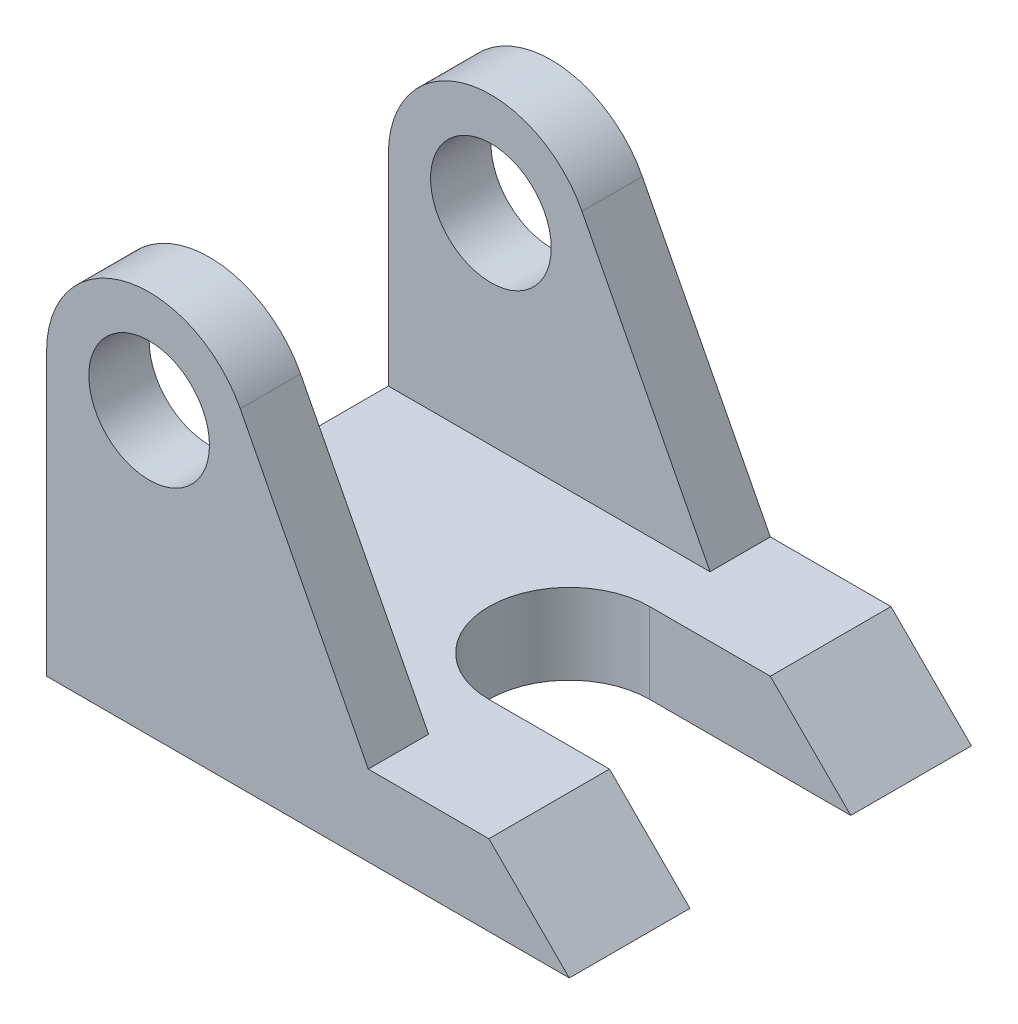
ISO-10303-21;
HEADER;
FILE_DESCRIPTION(('STEP AP214'),'2;1');
FILE_NAME('part.step','',(''),(''),'','','');
FILE_SCHEMA(('AUTOMOTIVE_DESIGN { 1 0 10303 214 1 1 1 1 }'));
ENDSEC;
DATA;
#1=APPLICATION_CONTEXT('core data for automotive mechanical design processes');
#2=APPLICATION_PROTOCOL_DEFINITION('international standard','automotive_design',2000,#1);
#3=PRODUCT_CONTEXT('',#1,'mechanical');
#4=PRODUCT('Part','Part','',(#3));
#5=PRODUCT_RELATED_PRODUCT_CATEGORY('part','',(#4));
#6=PRODUCT_DEFINITION_FORMATION('','',#4);
#7=PRODUCT_DEFINITION_CONTEXT('part definition',#1,'design');
#8=PRODUCT_DEFINITION('design','',#6,#7);
#9=PRODUCT_DEFINITION_SHAPE('','',#8);
#10=(LENGTH_UNIT() NAMED_UNIT(*) SI_UNIT(.MILLI.,.METRE.));
#11=(NAMED_UNIT(*) PLANE_ANGLE_UNIT() SI_UNIT($,.RADIAN.));
#12=(NAMED_UNIT(*) SI_UNIT($,.STERADIAN.) SOLID_ANGLE_UNIT());
#13=UNCERTAINTY_MEASURE_WITH_UNIT(LENGTH_MEASURE(1.E-05),#10,'distance_accuracy_value','');
#14=(GEOMETRIC_REPRESENTATION_CONTEXT(3) GLOBAL_UNCERTAINTY_ASSIGNED_CONTEXT((#13)) GLOBAL_UNIT_ASSIGNED_CONTEXT((#10,
#11,#12)) REPRESENTATION_CONTEXT('',''));
#15=CARTESIAN_POINT('',(0.,0.,0.));
#16=DIRECTION('',(0.,0.,1.));
#17=DIRECTION('',(1.,0.,0.));
#18=AXIS2_PLACEMENT_3D('',#15,#16,#17);
#19=CARTESIAN_POINT('',(25.5,70.,-50.));
#20=DIRECTION('',(0.,0.,-1.));
#21=DIRECTION('',(-1.,0.,0.));
#22=AXIS2_PLACEMENT_3D('',#19,#20,#21);
#23=PLANE('',#22);
#24=DIRECTION('',(0.,-1.,0.));
#25=VECTOR('',#24,1.);
#26=CARTESIAN_POINT('',(0.,0.,-50.));
#27=LINE('',#26,#25);
#28=CARTESIAN_POINT('',(0.,70.,-50.));
#29=VERTEX_POINT('',#28);
#30=CARTESIAN_POINT('',(0.,0.,-50.));
#31=VERTEX_POINT('',#30);
#32=EDGE_CURVE('E214',#29,#31,#27,.T.);
#33=ORIENTED_EDGE('',*,*,#32,.F.);
#34=CARTESIAN_POINT('',(25.5,70.,-50.));
#35=DIRECTION('',(0.,0.,1.));
#36=DIRECTION('',(-1.,0.,0.));
#37=AXIS2_PLACEMENT_3D('',#34,#35,#36);
#38=CIRCLE('',#37,25.5);
#39=CARTESIAN_POINT('',(48.1602175923075,81.6946371756151,-50.));
#40=VERTEX_POINT('',#39);
#41=EDGE_CURVE('E220',#40,#29,#38,.T.);
#42=ORIENTED_EDGE('',*,*,#41,.F.);
#43=DIRECTION('',(-0.458613222573142,0.888635984012057,0.));
#44=VECTOR('',#43,1.);
#45=CARTESIAN_POINT('',(80.,20.,-50.));
#46=LINE('',#45,#44);
#47=CARTESIAN_POINT('',(80.,20.,-50.));
#48=VERTEX_POINT('',#47);
#49=EDGE_CURVE('E251',#48,#40,#46,.T.);
#50=ORIENTED_EDGE('',*,*,#49,.F.);
#51=DIRECTION('',(-1.,0.,0.));
#52=VECTOR('',#51,1.);
#53=CARTESIAN_POINT('',(110.,20.,-50.));
#54=LINE('',#53,#52);
#55=CARTESIAN_POINT('',(110.,20.,-50.));
#56=VERTEX_POINT('',#55);
#57=EDGE_CURVE('E247',#56,#48,#54,.T.);
#58=ORIENTED_EDGE('',*,*,#57,.F.);
#59=DIRECTION('',(-0.707106781186548,0.707106781186547,0.));
#60=VECTOR('',#59,1.);
#61=CARTESIAN_POINT('',(130.,0.,-50.));
#62=LINE('',#61,#60);
#63=CARTESIAN_POINT('',(130.,0.,-50.));
#64=VERTEX_POINT('',#63);
#65=EDGE_CURVE('E243',#64,#56,#62,.T.);
#66=ORIENTED_EDGE('',*,*,#65,.F.);
#67=DIRECTION('',(1.,0.,0.));
#68=VECTOR('',#67,1.);
#69=CARTESIAN_POINT('',(0.,0.,-50.));
#70=LINE('',#69,#68);
#71=EDGE_CURVE('E239',#31,#64,#70,.T.);
#72=ORIENTED_EDGE('',*,*,#71,.F.);
#73=EDGE_LOOP('',(#33,#42,#50,#58,#66,#72));
#74=FACE_BOUND('',#73,.T.);
#75=CARTESIAN_POINT('',(25.5,70.,-50.));
#76=DIRECTION('',(0.,0.,1.));
#77=DIRECTION('',(1.,0.,0.));
#78=AXIS2_PLACEMENT_3D('',#75,#76,#77);
#79=CIRCLE('',#78,15.);
#80=CARTESIAN_POINT('',(40.5,70.,-50.));
#81=VERTEX_POINT('',#80);
#82=EDGE_CURVE('E386',#81,#81,#79,.T.);
#83=ORIENTED_EDGE('',*,*,#82,.T.);
#84=EDGE_LOOP('',(#83));
#85=FACE_BOUND('',#84,.T.);
#86=ADVANCED_FACE('F45',(#74,#85),#23,.T.);
#87=CARTESIAN_POINT('',(130.,0.,50.));
#88=DIRECTION('',(-0.707106781186547,-0.707106781186548,0.));
#89=DIRECTION('',(0.707106781186548,-0.707106781186547,0.));
#90=AXIS2_PLACEMENT_3D('',#87,#88,#89);
#91=PLANE('',#90);
#92=DIRECTION('',(0.,0.,-1.));
#93=VECTOR('',#92,1.);
#94=CARTESIAN_POINT('',(110.,20.,50.));
#95=LINE('',#94,#93);
#96=CARTESIAN_POINT('',(110.,20.,-20.));
#97=VERTEX_POINT('',#96);
#98=EDGE_CURVE('E272',#97,#56,#95,.T.);
#99=ORIENTED_EDGE('',*,*,#98,.F.);
#100=DIRECTION('',(0.707106781186548,-0.707106781186547,0.));
#101=VECTOR('',#100,1.);
#102=CARTESIAN_POINT('',(130.,0.,-20.));
#103=LINE('',#102,#101);
#104=CARTESIAN_POINT('',(130.,0.,-20.));
#105=VERTEX_POINT('',#104);
#106=EDGE_CURVE('E188',#97,#105,#103,.T.);
#107=ORIENTED_EDGE('',*,*,#106,.T.);
#108=DIRECTION('',(0.,0.,-1.));
#109=VECTOR('',#108,1.);
#110=CARTESIAN_POINT('',(130.,0.,50.));
#111=LINE('',#110,#109);
#112=EDGE_CURVE('E277',#105,#64,#111,.T.);
#113=ORIENTED_EDGE('',*,*,#112,.T.);
#114=ORIENTED_EDGE('',*,*,#65,.T.);
#115=EDGE_LOOP('',(#99,#107,#113,#114));
#116=FACE_BOUND('',#115,.T.);
#117=ADVANCED_FACE('F323',(#116),#91,.F.);
#118=CARTESIAN_POINT('',(0.,0.,50.));
#119=DIRECTION('',(1.,0.,0.));
#120=DIRECTION('',(0.,0.,-1.));
#121=AXIS2_PLACEMENT_3D('',#118,#119,#120);
#122=PLANE('',#121);
#123=DIRECTION('',(0.,1.,0.));
#124=VECTOR('',#123,1.);
#125=CARTESIAN_POINT('',(0.,0.,35.));
#126=LINE('',#125,#124);
#127=CARTESIAN_POINT('',(0.,20.,35.));
#128=VERTEX_POINT('',#127);
#129=CARTESIAN_POINT('',(0.,70.,35.));
#130=VERTEX_POINT('',#129);
#131=EDGE_CURVE('E208',#128,#130,#126,.T.);
#132=ORIENTED_EDGE('',*,*,#131,.F.);
#133=DIRECTION('',(0.,0.,1.));
#134=VECTOR('',#133,1.);
#135=CARTESIAN_POINT('',(0.,20.,50.));
#136=LINE('',#135,#134);
#137=CARTESIAN_POINT('',(0.,20.,-35.));
#138=VERTEX_POINT('',#137);
#139=EDGE_CURVE('E211',#138,#128,#136,.T.);
#140=ORIENTED_EDGE('',*,*,#139,.F.);
#141=DIRECTION('',(0.,-1.,0.));
#142=VECTOR('',#141,1.);
#143=CARTESIAN_POINT('',(0.,0.,-35.));
#144=LINE('',#143,#142);
#145=CARTESIAN_POINT('',(0.,70.,-35.));
#146=VERTEX_POINT('',#145);
#147=EDGE_CURVE('E202',#146,#138,#144,.T.);
#148=ORIENTED_EDGE('',*,*,#147,.F.);
#149=DIRECTION('',(0.,0.,-1.));
#150=VECTOR('',#149,1.);
#151=CARTESIAN_POINT('',(0.,70.,50.));
#152=LINE('',#151,#150);
#153=EDGE_CURVE('E235',#146,#29,#152,.T.);
#154=ORIENTED_EDGE('',*,*,#153,.T.);
#155=ORIENTED_EDGE('',*,*,#32,.T.);
#156=DIRECTION('',(0.,0.,-1.));
#157=VECTOR('',#156,1.);
#158=CARTESIAN_POINT('',(0.,0.,50.));
#159=LINE('',#158,#157);
#160=CARTESIAN_POINT('',(0.,0.,50.));
#161=VERTEX_POINT('',#160);
#162=EDGE_CURVE('E281',#161,#31,#159,.T.);
#163=ORIENTED_EDGE('',*,*,#162,.F.);
#164=DIRECTION('',(0.,-1.,0.));
#165=VECTOR('',#164,1.);
#166=CARTESIAN_POINT('',(0.,0.,50.));
#167=LINE('',#166,#165);
#168=CARTESIAN_POINT('',(0.,70.,50.));
#169=VERTEX_POINT('',#168);
#170=EDGE_CURVE('E215',#169,#161,#167,.T.);
#171=ORIENTED_EDGE('',*,*,#170,.F.);
#172=EDGE_CURVE('E258',#169,#130,#152,.T.);
#173=ORIENTED_EDGE('',*,*,#172,.T.);
#174=EDGE_LOOP('',(#132,#140,#148,#154,#155,#163,#171,#173));
#175=FACE_BOUND('',#174,.T.);
#176=ADVANCED_FACE('F47',(#175),#122,.F.);
#177=CARTESIAN_POINT('',(80.,20.,50.));
#178=DIRECTION('',(-0.888635984012057,-0.458613222573142,0.));
#179=DIRECTION('',(0.458613222573142,-0.888635984012058,0.));
#180=AXIS2_PLACEMENT_3D('',#177,#178,#179);
#181=PLANE('',#180);
#182=DIRECTION('',(0.458613222573142,-0.888635984012058,0.));
#183=VECTOR('',#182,1.);
#184=CARTESIAN_POINT('',(80.,20.,35.));
#185=LINE('',#184,#183);
#186=CARTESIAN_POINT('',(48.1602175923075,81.6946371756151,35.));
#187=VERTEX_POINT('',#186);
#188=CARTESIAN_POINT('',(80.,20.,35.));
#189=VERTEX_POINT('',#188);
#190=EDGE_CURVE('E205',#187,#189,#185,.T.);
#191=ORIENTED_EDGE('',*,*,#190,.F.);
#192=DIRECTION('',(0.,0.,-1.));
#193=VECTOR('',#192,1.);
#194=CARTESIAN_POINT('',(48.1602175923075,81.6946371756151,50.));
#195=LINE('',#194,#193);
#196=CARTESIAN_POINT('',(48.1602175923075,81.6946371756151,50.));
#197=VERTEX_POINT('',#196);
#198=EDGE_CURVE('E263',#197,#187,#195,.T.);
#199=ORIENTED_EDGE('',*,*,#198,.F.);
#200=DIRECTION('',(-0.458613222573142,0.888635984012057,0.));
#201=VECTOR('',#200,1.);
#202=CARTESIAN_POINT('',(80.,20.,50.));
#203=LINE('',#202,#201);
#204=CARTESIAN_POINT('',(80.,20.,50.));
#205=VERTEX_POINT('',#204);
#206=EDGE_CURVE('E229',#205,#197,#203,.T.);
#207=ORIENTED_EDGE('',*,*,#206,.F.);
#208=DIRECTION('',(0.,0.,-1.));
#209=VECTOR('',#208,1.);
#210=CARTESIAN_POINT('',(80.,20.,50.));
#211=LINE('',#210,#209);
#212=EDGE_CURVE('E268',#205,#189,#211,.T.);
#213=ORIENTED_EDGE('',*,*,#212,.T.);
#214=EDGE_LOOP('',(#191,#199,#207,#213));
#215=FACE_BOUND('',#214,.T.);
#216=ADVANCED_FACE('F299',(#215),#181,.F.);
#217=DIRECTION('',(-0.458613222573142,0.888635984012058,0.));
#218=VECTOR('',#217,1.);
#219=CARTESIAN_POINT('',(80.,20.,-35.));
#220=LINE('',#219,#218);
#221=CARTESIAN_POINT('',(80.,20.,-35.));
#222=VERTEX_POINT('',#221);
#223=CARTESIAN_POINT('',(48.1602175923075,81.6946371756151,-35.));
#224=VERTEX_POINT('',#223);
#225=EDGE_CURVE('E70',#222,#224,#220,.T.);
#226=ORIENTED_EDGE('',*,*,#225,.F.);
#227=EDGE_CURVE('E267',#222,#48,#211,.T.);
#228=ORIENTED_EDGE('',*,*,#227,.T.);
#229=ORIENTED_EDGE('',*,*,#49,.T.);
#230=EDGE_CURVE('E262',#224,#40,#195,.T.);
#231=ORIENTED_EDGE('',*,*,#230,.F.);
#232=EDGE_LOOP('',(#226,#228,#229,#231));
#233=FACE_BOUND('',#232,.T.);
#234=ADVANCED_FACE('F340',(#233),#181,.F.);
#235=CARTESIAN_POINT('',(25.5,70.,50.));
#236=DIRECTION('',(0.,0.,-1.));
#237=DIRECTION('',(-1.,0.,0.));
#238=AXIS2_PLACEMENT_3D('',#235,#236,#237);
#239=CYLINDRICAL_SURFACE('',#238,25.5);
#240=ORIENTED_EDGE('',*,*,#198,.T.);
#241=CARTESIAN_POINT('',(25.5,70.,35.));
#242=DIRECTION('',(0.,0.,-1.));
#243=DIRECTION('',(-1.,0.,0.));
#244=AXIS2_PLACEMENT_3D('',#241,#242,#243);
#245=CIRCLE('',#244,25.5);
#246=EDGE_CURVE('E55',#130,#187,#245,.T.);
#247=ORIENTED_EDGE('',*,*,#246,.F.);
#248=ORIENTED_EDGE('',*,*,#172,.F.);
#249=CARTESIAN_POINT('',(25.5,70.,50.));
#250=DIRECTION('',(0.,0.,1.));
#251=DIRECTION('',(-1.,0.,0.));
#252=AXIS2_PLACEMENT_3D('',#249,#250,#251);
#253=CIRCLE('',#252,25.5);
#254=EDGE_CURVE('E232',#197,#169,#253,.T.);
#255=ORIENTED_EDGE('',*,*,#254,.F.);
#256=EDGE_LOOP('',(#240,#247,#248,#255));
#257=FACE_BOUND('',#256,.T.);
#258=ADVANCED_FACE('F303',(#257),#239,.T.);
#259=ORIENTED_EDGE('',*,*,#153,.F.);
#260=CARTESIAN_POINT('',(25.5,70.,-35.));
#261=DIRECTION('',(0.,0.,1.));
#262=DIRECTION('',(1.,0.,0.));
#263=AXIS2_PLACEMENT_3D('',#260,#261,#262);
#264=CIRCLE('',#263,25.5);
#265=EDGE_CURVE('E285',#224,#146,#264,.T.);
#266=ORIENTED_EDGE('',*,*,#265,.F.);
#267=ORIENTED_EDGE('',*,*,#230,.T.);
#268=ORIENTED_EDGE('',*,*,#41,.T.);
#269=EDGE_LOOP('',(#259,#266,#267,#268));
#270=FACE_BOUND('',#269,.T.);
#271=ADVANCED_FACE('F333',(#270),#239,.T.);
#272=CARTESIAN_POINT('',(0.,0.,50.));
#273=DIRECTION('',(0.,1.,0.));
#274=DIRECTION('',(0.,0.,1.));
#275=AXIS2_PLACEMENT_3D('',#272,#273,#274);
#276=PLANE('',#275);
#277=ORIENTED_EDGE('',*,*,#112,.F.);
#278=DIRECTION('',(-1.,0.,0.));
#279=VECTOR('',#278,1.);
#280=CARTESIAN_POINT('',(80.,0.,-20.));
#281=LINE('',#280,#279);
#282=CARTESIAN_POINT('',(80.,0.,-20.));
#283=VERTEX_POINT('',#282);
#284=EDGE_CURVE('E157',#105,#283,#281,.T.);
#285=ORIENTED_EDGE('',*,*,#284,.T.);
#286=CARTESIAN_POINT('',(80.,0.,0.));
#287=DIRECTION('',(0.,1.,0.));
#288=DIRECTION('',(-1.,0.,0.));
#289=AXIS2_PLACEMENT_3D('',#286,#287,#288);
#290=CIRCLE('',#289,20.);
#291=CARTESIAN_POINT('',(80.,0.,20.));
#292=VERTEX_POINT('',#291);
#293=EDGE_CURVE('E151',#283,#292,#290,.T.);
#294=ORIENTED_EDGE('',*,*,#293,.T.);
#295=DIRECTION('',(1.,0.,0.));
#296=VECTOR('',#295,1.);
#297=CARTESIAN_POINT('',(153.648677571019,0.,20.));
#298=LINE('',#297,#296);
#299=CARTESIAN_POINT('',(130.,0.,20.));
#300=VERTEX_POINT('',#299);
#301=EDGE_CURVE('E160',#292,#300,#298,.T.);
#302=ORIENTED_EDGE('',*,*,#301,.T.);
#303=CARTESIAN_POINT('',(130.,0.,50.));
#304=VERTEX_POINT('',#303);
#305=EDGE_CURVE('E278',#304,#300,#111,.T.);
#306=ORIENTED_EDGE('',*,*,#305,.F.);
#307=DIRECTION('',(1.,0.,0.));
#308=VECTOR('',#307,1.);
#309=CARTESIAN_POINT('',(0.,0.,50.));
#310=LINE('',#309,#308);
#311=EDGE_CURVE('E219',#161,#304,#310,.T.);
#312=ORIENTED_EDGE('',*,*,#311,.F.);
#313=ORIENTED_EDGE('',*,*,#162,.T.);
#314=ORIENTED_EDGE('',*,*,#71,.T.);
#315=EDGE_LOOP('',(#277,#285,#294,#302,#306,#312,#313,#314));
#316=FACE_BOUND('',#315,.T.);
#317=ADVANCED_FACE('F170',(#316),#276,.F.);
#318=ORIENTED_EDGE('',*,*,#305,.T.);
#319=DIRECTION('',(-0.707106781186548,0.707106781186547,0.));
#320=VECTOR('',#319,1.);
#321=CARTESIAN_POINT('',(130.,0.,20.));
#322=LINE('',#321,#320);
#323=CARTESIAN_POINT('',(110.,20.,20.));
#324=VERTEX_POINT('',#323);
#325=EDGE_CURVE('E163',#300,#324,#322,.T.);
#326=ORIENTED_EDGE('',*,*,#325,.T.);
#327=CARTESIAN_POINT('',(110.,20.,50.));
#328=VERTEX_POINT('',#327);
#329=EDGE_CURVE('E273',#328,#324,#95,.T.);
#330=ORIENTED_EDGE('',*,*,#329,.F.);
#331=DIRECTION('',(-0.707106781186548,0.707106781186547,0.));
#332=VECTOR('',#331,1.);
#333=CARTESIAN_POINT('',(130.,0.,50.));
#334=LINE('',#333,#332);
#335=EDGE_CURVE('E223',#304,#328,#334,.T.);
#336=ORIENTED_EDGE('',*,*,#335,.F.);
#337=EDGE_LOOP('',(#318,#326,#330,#336));
#338=FACE_BOUND('',#337,.T.);
#339=ADVANCED_FACE('F319',(#338),#91,.F.);
#340=CARTESIAN_POINT('',(110.,20.,50.));
#341=DIRECTION('',(0.,-1.,0.));
#342=DIRECTION('',(1.,0.,0.));
#343=AXIS2_PLACEMENT_3D('',#340,#341,#342);
#344=PLANE('',#343);
#345=CARTESIAN_POINT('',(80.,20.,0.));
#346=DIRECTION('',(0.,1.,0.));
#347=DIRECTION('',(-1.,0.,0.));
#348=AXIS2_PLACEMENT_3D('',#345,#346,#347);
#349=CIRCLE('',#348,20.);
#350=CARTESIAN_POINT('',(80.,20.,-20.));
#351=VERTEX_POINT('',#350);
#352=CARTESIAN_POINT('',(80.,20.,20.));
#353=VERTEX_POINT('',#352);
#354=EDGE_CURVE('E62',#351,#353,#349,.T.);
#355=ORIENTED_EDGE('',*,*,#354,.F.);
#356=DIRECTION('',(1.,0.,0.));
#357=VECTOR('',#356,1.);
#358=CARTESIAN_POINT('',(110.,20.,-20.));
#359=LINE('',#358,#357);
#360=EDGE_CURVE('E11',#351,#97,#359,.T.);
#361=ORIENTED_EDGE('',*,*,#360,.T.);
#362=ORIENTED_EDGE('',*,*,#98,.T.);
#363=ORIENTED_EDGE('',*,*,#57,.T.);
#364=ORIENTED_EDGE('',*,*,#227,.F.);
#365=DIRECTION('',(-1.,0.,0.));
#366=VECTOR('',#365,1.);
#367=CARTESIAN_POINT('',(-16.2301590856829,20.,-35.));
#368=LINE('',#367,#366);
#369=EDGE_CURVE('E196',#222,#138,#368,.T.);
#370=ORIENTED_EDGE('',*,*,#369,.T.);
#371=ORIENTED_EDGE('',*,*,#139,.T.);
#372=DIRECTION('',(1.,0.,0.));
#373=VECTOR('',#372,1.);
#374=CARTESIAN_POINT('',(-16.2301590856829,20.,35.));
#375=LINE('',#374,#373);
#376=EDGE_CURVE('E192',#128,#189,#375,.T.);
#377=ORIENTED_EDGE('',*,*,#376,.T.);
#378=ORIENTED_EDGE('',*,*,#212,.F.);
#379=DIRECTION('',(-1.,0.,0.));
#380=VECTOR('',#379,1.);
#381=CARTESIAN_POINT('',(110.,20.,50.));
#382=LINE('',#381,#380);
#383=EDGE_CURVE('E226',#328,#205,#382,.T.);
#384=ORIENTED_EDGE('',*,*,#383,.F.);
#385=ORIENTED_EDGE('',*,*,#329,.T.);
#386=DIRECTION('',(1.,0.,0.));
#387=VECTOR('',#386,1.);
#388=CARTESIAN_POINT('',(153.648677571019,20.,20.));
#389=LINE('',#388,#387);
#390=EDGE_CURVE('E172',#353,#324,#389,.T.);
#391=ORIENTED_EDGE('',*,*,#390,.F.);
#392=EDGE_LOOP('',(#355,#361,#362,#363,#364,#370,#371,#377,#378,#384,#385,#391));
#393=FACE_BOUND('',#392,.T.);
#394=ADVANCED_FACE('F312',(#393),#344,.F.);
#395=CARTESIAN_POINT('',(25.5,70.,50.));
#396=DIRECTION('',(0.,0.,-1.));
#397=DIRECTION('',(-1.,0.,0.));
#398=AXIS2_PLACEMENT_3D('',#395,#396,#397);
#399=PLANE('',#398);
#400=CARTESIAN_POINT('',(25.5,70.,50.));
#401=DIRECTION('',(0.,0.,1.));
#402=DIRECTION('',(1.,0.,0.));
#403=AXIS2_PLACEMENT_3D('',#400,#401,#402);
#404=CIRCLE('',#403,15.);
#405=CARTESIAN_POINT('',(40.5,70.,50.));
#406=VERTEX_POINT('',#405);
#407=EDGE_CURVE('E388',#406,#406,#404,.T.);
#408=ORIENTED_EDGE('',*,*,#407,.F.);
#409=EDGE_LOOP('',(#408));
#410=FACE_BOUND('',#409,.T.);
#411=ORIENTED_EDGE('',*,*,#170,.T.);
#412=ORIENTED_EDGE('',*,*,#311,.T.);
#413=ORIENTED_EDGE('',*,*,#335,.T.);
#414=ORIENTED_EDGE('',*,*,#383,.T.);
#415=ORIENTED_EDGE('',*,*,#206,.T.);
#416=ORIENTED_EDGE('',*,*,#254,.T.);
#417=EDGE_LOOP('',(#411,#412,#413,#414,#415,#416));
#418=FACE_BOUND('',#417,.T.);
#419=ADVANCED_FACE('F306',(#410,#418),#399,.F.);
#420=CARTESIAN_POINT('',(-16.2301590856829,95.5,35.));
#421=DIRECTION('',(0.,0.,-1.));
#422=DIRECTION('',(-1.,0.,0.));
#423=AXIS2_PLACEMENT_3D('',#420,#421,#422);
#424=PLANE('',#423);
#425=CARTESIAN_POINT('',(25.5,70.,35.));
#426=DIRECTION('',(0.,0.,-1.));
#427=DIRECTION('',(-1.,0.,0.));
#428=AXIS2_PLACEMENT_3D('',#425,#426,#427);
#429=CIRCLE('',#428,15.);
#430=CARTESIAN_POINT('',(10.5,70.,35.));
#431=VERTEX_POINT('',#430);
#432=EDGE_CURVE('E177',#431,#431,#429,.T.);
#433=ORIENTED_EDGE('',*,*,#432,.F.);
#434=EDGE_LOOP('',(#433));
#435=FACE_BOUND('',#434,.T.);
#436=ORIENTED_EDGE('',*,*,#131,.T.);
#437=ORIENTED_EDGE('',*,*,#246,.T.);
#438=ORIENTED_EDGE('',*,*,#190,.T.);
#439=ORIENTED_EDGE('',*,*,#376,.F.);
#440=EDGE_LOOP('',(#436,#437,#438,#439));
#441=FACE_BOUND('',#440,.T.);
#442=ADVANCED_FACE('F292',(#435,#441),#424,.T.);
#443=CARTESIAN_POINT('',(-16.2301590856829,95.5,-35.));
#444=DIRECTION('',(0.,0.,1.));
#445=DIRECTION('',(1.,0.,0.));
#446=AXIS2_PLACEMENT_3D('',#443,#444,#445);
#447=PLANE('',#446);
#448=CARTESIAN_POINT('',(25.5,70.,-35.));
#449=DIRECTION('',(0.,0.,1.));
#450=DIRECTION('',(1.,0.,0.));
#451=AXIS2_PLACEMENT_3D('',#448,#449,#450);
#452=CIRCLE('',#451,15.);
#453=CARTESIAN_POINT('',(40.5,70.,-35.));
#454=VERTEX_POINT('',#453);
#455=EDGE_CURVE('E49',#454,#454,#452,.T.);
#456=ORIENTED_EDGE('',*,*,#455,.F.);
#457=EDGE_LOOP('',(#456));
#458=FACE_BOUND('',#457,.T.);
#459=ORIENTED_EDGE('',*,*,#147,.T.);
#460=ORIENTED_EDGE('',*,*,#369,.F.);
#461=ORIENTED_EDGE('',*,*,#225,.T.);
#462=ORIENTED_EDGE('',*,*,#265,.T.);
#463=EDGE_LOOP('',(#459,#460,#461,#462));
#464=FACE_BOUND('',#463,.T.);
#465=ADVANCED_FACE('F362',(#458,#464),#447,.T.);
#466=CARTESIAN_POINT('',(80.,0.,-20.));
#467=DIRECTION('',(0.,0.,-1.));
#468=DIRECTION('',(-1.,0.,0.));
#469=AXIS2_PLACEMENT_3D('',#466,#467,#468);
#470=PLANE('',#469);
#471=ORIENTED_EDGE('',*,*,#360,.F.);
#472=DIRECTION('',(0.,1.,0.));
#473=VECTOR('',#472,1.);
#474=CARTESIAN_POINT('',(80.,0.,-20.));
#475=LINE('',#474,#473);
#476=EDGE_CURVE('E156',#283,#351,#475,.T.);
#477=ORIENTED_EDGE('',*,*,#476,.F.);
#478=ORIENTED_EDGE('',*,*,#284,.F.);
#479=ORIENTED_EDGE('',*,*,#106,.F.);
#480=EDGE_LOOP('',(#471,#477,#478,#479));
#481=FACE_BOUND('',#480,.T.);
#482=ADVANCED_FACE('F366',(#481),#470,.F.);
#483=CARTESIAN_POINT('',(153.648677571019,0.,20.));
#484=DIRECTION('',(0.,0.,1.));
#485=DIRECTION('',(1.,0.,0.));
#486=AXIS2_PLACEMENT_3D('',#483,#484,#485);
#487=PLANE('',#486);
#488=ORIENTED_EDGE('',*,*,#301,.F.);
#489=DIRECTION('',(0.,1.,0.));
#490=VECTOR('',#489,1.);
#491=CARTESIAN_POINT('',(80.,0.,20.));
#492=LINE('',#491,#490);
#493=EDGE_CURVE('E147',#292,#353,#492,.T.);
#494=ORIENTED_EDGE('',*,*,#493,.T.);
#495=ORIENTED_EDGE('',*,*,#390,.T.);
#496=ORIENTED_EDGE('',*,*,#325,.F.);
#497=EDGE_LOOP('',(#488,#494,#495,#496));
#498=FACE_BOUND('',#497,.T.);
#499=ADVANCED_FACE('F161',(#498),#487,.F.);
#500=CARTESIAN_POINT('',(80.,0.,0.));
#501=DIRECTION('',(0.,1.,0.));
#502=DIRECTION('',(-1.,0.,0.));
#503=AXIS2_PLACEMENT_3D('',#500,#501,#502);
#504=CYLINDRICAL_SURFACE('',#503,20.);
#505=ORIENTED_EDGE('',*,*,#354,.T.);
#506=ORIENTED_EDGE('',*,*,#493,.F.);
#507=ORIENTED_EDGE('',*,*,#293,.F.);
#508=ORIENTED_EDGE('',*,*,#476,.T.);
#509=EDGE_LOOP('',(#505,#506,#507,#508));
#510=FACE_BOUND('',#509,.T.);
#511=ADVANCED_FACE('F149',(#510),#504,.F.);
#512=CARTESIAN_POINT('',(25.5,70.,50.));
#513=DIRECTION('',(0.,0.,1.));
#514=DIRECTION('',(1.,0.,0.));
#515=AXIS2_PLACEMENT_3D('',#512,#513,#514);
#516=CYLINDRICAL_SURFACE('',#515,15.);
#517=ORIENTED_EDGE('',*,*,#455,.T.);
#518=EDGE_LOOP('',(#517));
#519=FACE_BOUND('',#518,.T.);
#520=ORIENTED_EDGE('',*,*,#82,.F.);
#521=EDGE_LOOP('',(#520));
#522=FACE_BOUND('',#521,.T.);
#523=ADVANCED_FACE('F369',(#519,#522),#516,.F.);
#524=ORIENTED_EDGE('',*,*,#432,.T.);
#525=EDGE_LOOP('',(#524));
#526=FACE_BOUND('',#525,.T.);
#527=ORIENTED_EDGE('',*,*,#407,.T.);
#528=EDGE_LOOP('',(#527));
#529=FACE_BOUND('',#528,.T.);
#530=ADVANCED_FACE('F375',(#526,#529),#516,.F.);
#531=CLOSED_SHELL('',(#86,#117,#176,#216,#234,#258,#271,#317,#339,#394,#419,#442,#465,#482,#499,
#511,#523,#530));
#532=MANIFOLD_SOLID_BREP('B2',#531);
#533=ADVANCED_BREP_SHAPE_REPRESENTATION('',(#18,#532),#14);
#534=SHAPE_DEFINITION_REPRESENTATION(#9,#533);
ENDSEC;
END-ISO-10303-21;
